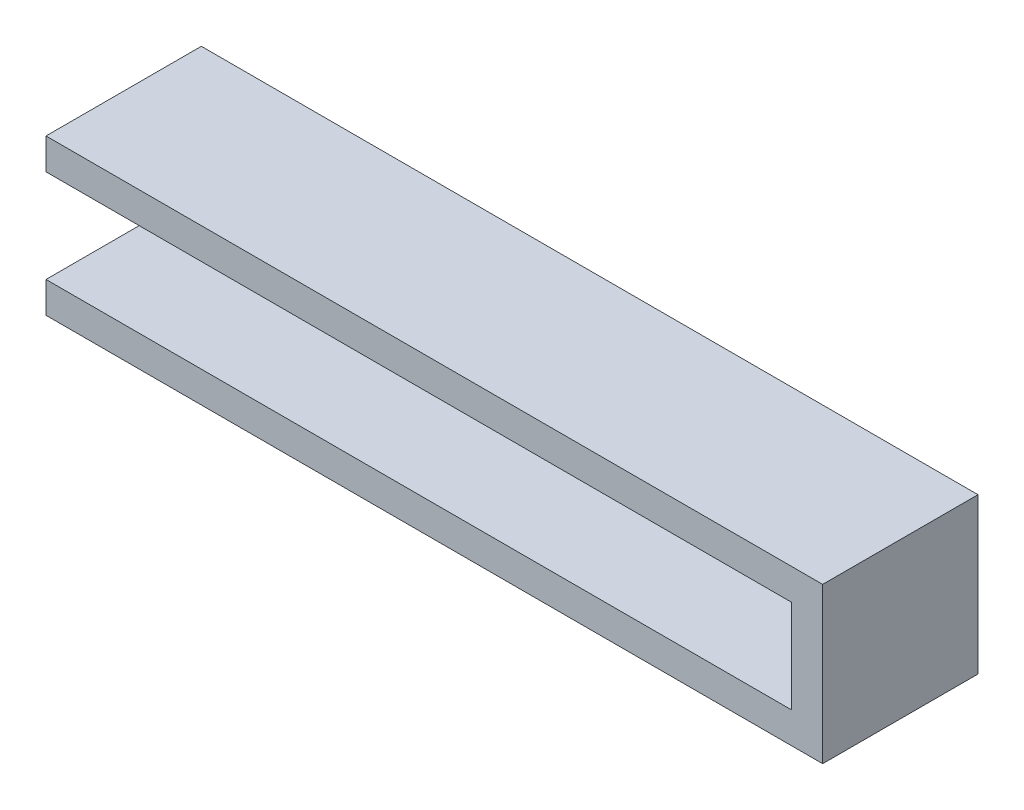
ISO-10303-21;
HEADER;
FILE_DESCRIPTION(('STEP AP214'),'2;1');
FILE_NAME('part.step','',(''),(''),'','','');
FILE_SCHEMA(('AUTOMOTIVE_DESIGN { 1 0 10303 214 1 1 1 1 }'));
ENDSEC;
DATA;
#1=APPLICATION_CONTEXT('core data for automotive mechanical design processes');
#2=APPLICATION_PROTOCOL_DEFINITION('international standard','automotive_design',2000,#1);
#3=PRODUCT_CONTEXT('',#1,'mechanical');
#4=PRODUCT('Part','Part','',(#3));
#5=PRODUCT_RELATED_PRODUCT_CATEGORY('part','',(#4));
#6=PRODUCT_DEFINITION_FORMATION('','',#4);
#7=PRODUCT_DEFINITION_CONTEXT('part definition',#1,'design');
#8=PRODUCT_DEFINITION('design','',#6,#7);
#9=PRODUCT_DEFINITION_SHAPE('','',#8);
#10=(LENGTH_UNIT() NAMED_UNIT(*) SI_UNIT(.MILLI.,.METRE.));
#11=(NAMED_UNIT(*) PLANE_ANGLE_UNIT() SI_UNIT($,.RADIAN.));
#12=(NAMED_UNIT(*) SI_UNIT($,.STERADIAN.) SOLID_ANGLE_UNIT());
#13=UNCERTAINTY_MEASURE_WITH_UNIT(LENGTH_MEASURE(1.E-05),#10,'distance_accuracy_value','');
#14=(GEOMETRIC_REPRESENTATION_CONTEXT(3) GLOBAL_UNCERTAINTY_ASSIGNED_CONTEXT((#13)) GLOBAL_UNIT_ASSIGNED_CONTEXT((#10,
#11,#12)) REPRESENTATION_CONTEXT('',''));
#15=CARTESIAN_POINT('',(0.,0.,0.));
#16=DIRECTION('',(0.,0.,1.));
#17=DIRECTION('',(1.,0.,0.));
#18=AXIS2_PLACEMENT_3D('',#15,#16,#17);
#19=CARTESIAN_POINT('',(12.5,-2.5,-5.));
#20=DIRECTION('',(-1.,0.,0.));
#21=DIRECTION('',(0.,0.,-1.));
#22=AXIS2_PLACEMENT_3D('',#19,#20,#21);
#23=PLANE('',#22);
#24=DIRECTION('',(0.,1.,0.));
#25=VECTOR('',#24,1.);
#26=CARTESIAN_POINT('',(12.5,-2.5,0.));
#27=LINE('',#26,#25);
#28=CARTESIAN_POINT('',(12.5,-2.5,0.));
#29=VERTEX_POINT('',#28);
#30=CARTESIAN_POINT('',(12.5,2.5,0.));
#31=VERTEX_POINT('',#30);
#32=EDGE_CURVE('E147',#29,#31,#27,.T.);
#33=ORIENTED_EDGE('',*,*,#32,.F.);
#34=DIRECTION('',(0.,0.,1.));
#35=VECTOR('',#34,1.);
#36=CARTESIAN_POINT('',(12.5,-2.5,-5.));
#37=LINE('',#36,#35);
#38=CARTESIAN_POINT('',(12.5,-2.5,-5.));
#39=VERTEX_POINT('',#38);
#40=EDGE_CURVE('E160',#39,#29,#37,.T.);
#41=ORIENTED_EDGE('',*,*,#40,.F.);
#42=DIRECTION('',(0.,1.,0.));
#43=VECTOR('',#42,1.);
#44=CARTESIAN_POINT('',(12.5,-2.5,-5.));
#45=LINE('',#44,#43);
#46=CARTESIAN_POINT('',(12.5,2.5,-5.));
#47=VERTEX_POINT('',#46);
#48=EDGE_CURVE('E148',#39,#47,#45,.T.);
#49=ORIENTED_EDGE('',*,*,#48,.T.);
#50=DIRECTION('',(0.,0.,1.));
#51=VECTOR('',#50,1.);
#52=CARTESIAN_POINT('',(12.5,2.5,-5.));
#53=LINE('',#52,#51);
#54=EDGE_CURVE('E11',#47,#31,#53,.T.);
#55=ORIENTED_EDGE('',*,*,#54,.T.);
#56=EDGE_LOOP('',(#33,#41,#49,#55));
#57=FACE_BOUND('',#56,.T.);
#58=ADVANCED_FACE('F37',(#57),#23,.F.);
#59=CARTESIAN_POINT('',(-12.5,2.5,-5.));
#60=DIRECTION('',(0.,-1.,0.));
#61=DIRECTION('',(0.,0.,1.));
#62=AXIS2_PLACEMENT_3D('',#59,#60,#61);
#63=PLANE('',#62);
#64=DIRECTION('',(-1.,0.,0.));
#65=VECTOR('',#64,1.);
#66=CARTESIAN_POINT('',(-12.5,2.5,0.));
#67=LINE('',#66,#65);
#68=CARTESIAN_POINT('',(-12.5,2.5,0.));
#69=VERTEX_POINT('',#68);
#70=EDGE_CURVE('E163',#31,#69,#67,.T.);
#71=ORIENTED_EDGE('',*,*,#70,.F.);
#72=ORIENTED_EDGE('',*,*,#54,.F.);
#73=DIRECTION('',(-1.,0.,0.));
#74=VECTOR('',#73,1.);
#75=CARTESIAN_POINT('',(-12.5,2.5,-5.));
#76=LINE('',#75,#74);
#77=CARTESIAN_POINT('',(-12.5,2.5,-5.));
#78=VERTEX_POINT('',#77);
#79=EDGE_CURVE('E151',#47,#78,#76,.T.);
#80=ORIENTED_EDGE('',*,*,#79,.T.);
#81=DIRECTION('',(0.,0.,1.));
#82=VECTOR('',#81,1.);
#83=CARTESIAN_POINT('',(-12.5,2.5,-5.));
#84=LINE('',#83,#82);
#85=EDGE_CURVE('E45',#78,#69,#84,.T.);
#86=ORIENTED_EDGE('',*,*,#85,.T.);
#87=EDGE_LOOP('',(#71,#72,#80,#86));
#88=FACE_BOUND('',#87,.T.);
#89=ADVANCED_FACE('F178',(#88),#63,.F.);
#90=CARTESIAN_POINT('',(-12.5,-2.5,-5.));
#91=DIRECTION('',(1.,0.,0.));
#92=DIRECTION('',(0.,0.,1.));
#93=AXIS2_PLACEMENT_3D('',#90,#91,#92);
#94=PLANE('',#93);
#95=DIRECTION('',(0.,1.,0.));
#96=VECTOR('',#95,1.);
#97=CARTESIAN_POINT('',(-12.5,-1.5,-3.));
#98=LINE('',#97,#96);
#99=CARTESIAN_POINT('',(-12.5,-1.5,-3.));
#100=VERTEX_POINT('',#99);
#101=CARTESIAN_POINT('',(-12.5,1.5,-3.));
#102=VERTEX_POINT('',#101);
#103=EDGE_CURVE('E109',#100,#102,#98,.T.);
#104=ORIENTED_EDGE('',*,*,#103,.T.);
#105=DIRECTION('',(0.,0.,1.));
#106=VECTOR('',#105,1.);
#107=CARTESIAN_POINT('',(-12.5,1.5,-3.));
#108=LINE('',#107,#106);
#109=CARTESIAN_POINT('',(-12.5,1.5,0.));
#110=VERTEX_POINT('',#109);
#111=EDGE_CURVE('E114',#102,#110,#108,.T.);
#112=ORIENTED_EDGE('',*,*,#111,.T.);
#113=DIRECTION('',(0.,-1.,0.));
#114=VECTOR('',#113,1.);
#115=CARTESIAN_POINT('',(-12.5,-2.5,0.));
#116=LINE('',#115,#114);
#117=EDGE_CURVE('E167',#69,#110,#116,.T.);
#118=ORIENTED_EDGE('',*,*,#117,.F.);
#119=ORIENTED_EDGE('',*,*,#85,.F.);
#120=DIRECTION('',(0.,-1.,0.));
#121=VECTOR('',#120,1.);
#122=CARTESIAN_POINT('',(-12.5,-2.5,-5.));
#123=LINE('',#122,#121);
#124=CARTESIAN_POINT('',(-12.5,-2.5,-5.));
#125=VERTEX_POINT('',#124);
#126=EDGE_CURVE('E155',#78,#125,#123,.T.);
#127=ORIENTED_EDGE('',*,*,#126,.T.);
#128=DIRECTION('',(0.,0.,1.));
#129=VECTOR('',#128,1.);
#130=CARTESIAN_POINT('',(-12.5,-2.5,-5.));
#131=LINE('',#130,#129);
#132=CARTESIAN_POINT('',(-12.5,-2.5,0.));
#133=VERTEX_POINT('',#132);
#134=EDGE_CURVE('E172',#125,#133,#131,.T.);
#135=ORIENTED_EDGE('',*,*,#134,.T.);
#136=CARTESIAN_POINT('',(-12.5,-1.5,0.));
#137=VERTEX_POINT('',#136);
#138=EDGE_CURVE('E166',#137,#133,#116,.T.);
#139=ORIENTED_EDGE('',*,*,#138,.F.);
#140=DIRECTION('',(0.,0.,1.));
#141=VECTOR('',#140,1.);
#142=CARTESIAN_POINT('',(-12.5,-1.5,-3.));
#143=LINE('',#142,#141);
#144=EDGE_CURVE('E124',#100,#137,#143,.T.);
#145=ORIENTED_EDGE('',*,*,#144,.F.);
#146=EDGE_LOOP('',(#104,#112,#118,#119,#127,#135,#139,#145));
#147=FACE_BOUND('',#146,.T.);
#148=ADVANCED_FACE('F121',(#147),#94,.F.);
#149=CARTESIAN_POINT('',(-12.5,-2.5,-5.));
#150=DIRECTION('',(0.,1.,0.));
#151=DIRECTION('',(0.,0.,-1.));
#152=AXIS2_PLACEMENT_3D('',#149,#150,#151);
#153=PLANE('',#152);
#154=DIRECTION('',(1.,0.,0.));
#155=VECTOR('',#154,1.);
#156=CARTESIAN_POINT('',(-12.5,-2.5,0.));
#157=LINE('',#156,#155);
#158=EDGE_CURVE('E152',#133,#29,#157,.T.);
#159=ORIENTED_EDGE('',*,*,#158,.F.);
#160=ORIENTED_EDGE('',*,*,#134,.F.);
#161=DIRECTION('',(1.,0.,0.));
#162=VECTOR('',#161,1.);
#163=CARTESIAN_POINT('',(-12.5,-2.5,-5.));
#164=LINE('',#163,#162);
#165=EDGE_CURVE('E158',#125,#39,#164,.T.);
#166=ORIENTED_EDGE('',*,*,#165,.T.);
#167=ORIENTED_EDGE('',*,*,#40,.T.);
#168=EDGE_LOOP('',(#159,#160,#166,#167));
#169=FACE_BOUND('',#168,.T.);
#170=ADVANCED_FACE('F191',(#169),#153,.F.);
#171=CARTESIAN_POINT('',(0.,0.,-5.));
#172=DIRECTION('',(0.,0.,1.));
#173=DIRECTION('',(-1.,0.,0.));
#174=AXIS2_PLACEMENT_3D('',#171,#172,#173);
#175=PLANE('',#174);
#176=CARTESIAN_POINT('',(-10.4078,0.,-5.));
#177=DIRECTION('',(0.,0.,1.));
#178=DIRECTION('',(1.,0.,0.));
#179=AXIS2_PLACEMENT_3D('',#176,#177,#178);
#180=CIRCLE('',#179,1.0922);
#181=CARTESIAN_POINT('',(-9.3156,0.,-5.));
#182=VERTEX_POINT('',#181);
#183=EDGE_CURVE('E141',#182,#182,#180,.T.);
#184=ORIENTED_EDGE('',*,*,#183,.T.);
#185=EDGE_LOOP('',(#184));
#186=FACE_BOUND('',#185,.T.);
#187=CARTESIAN_POINT('',(10.4078,0.,-5.));
#188=DIRECTION('',(0.,0.,1.));
#189=DIRECTION('',(1.,0.,0.));
#190=AXIS2_PLACEMENT_3D('',#187,#188,#189);
#191=CIRCLE('',#190,1.0922);
#192=CARTESIAN_POINT('',(11.5,0.,-5.));
#193=VERTEX_POINT('',#192);
#194=EDGE_CURVE('E144',#193,#193,#191,.T.);
#195=ORIENTED_EDGE('',*,*,#194,.T.);
#196=EDGE_LOOP('',(#195));
#197=FACE_BOUND('',#196,.T.);
#198=ORIENTED_EDGE('',*,*,#48,.F.);
#199=ORIENTED_EDGE('',*,*,#165,.F.);
#200=ORIENTED_EDGE('',*,*,#126,.F.);
#201=ORIENTED_EDGE('',*,*,#79,.F.);
#202=EDGE_LOOP('',(#198,#199,#200,#201));
#203=FACE_BOUND('',#202,.T.);
#204=ADVANCED_FACE('F188',(#186,#197,#203),#175,.F.);
#205=CARTESIAN_POINT('',(0.,0.,0.));
#206=DIRECTION('',(0.,0.,1.));
#207=DIRECTION('',(-1.,0.,0.));
#208=AXIS2_PLACEMENT_3D('',#205,#206,#207);
#209=PLANE('',#208);
#210=DIRECTION('',(-1.,0.,0.));
#211=VECTOR('',#210,1.);
#212=CARTESIAN_POINT('',(11.5,-1.5,0.));
#213=LINE('',#212,#211);
#214=CARTESIAN_POINT('',(11.5,-1.5,0.));
#215=VERTEX_POINT('',#214);
#216=EDGE_CURVE('E125',#215,#137,#213,.T.);
#217=ORIENTED_EDGE('',*,*,#216,.T.);
#218=ORIENTED_EDGE('',*,*,#138,.T.);
#219=ORIENTED_EDGE('',*,*,#158,.T.);
#220=ORIENTED_EDGE('',*,*,#32,.T.);
#221=ORIENTED_EDGE('',*,*,#70,.T.);
#222=ORIENTED_EDGE('',*,*,#117,.T.);
#223=DIRECTION('',(1.,0.,0.));
#224=VECTOR('',#223,1.);
#225=CARTESIAN_POINT('',(11.5,1.5,0.));
#226=LINE('',#225,#224);
#227=CARTESIAN_POINT('',(11.5,1.5,0.));
#228=VERTEX_POINT('',#227);
#229=EDGE_CURVE('E52',#110,#228,#226,.T.);
#230=ORIENTED_EDGE('',*,*,#229,.T.);
#231=DIRECTION('',(0.,-1.,0.));
#232=VECTOR('',#231,1.);
#233=CARTESIAN_POINT('',(11.5,-1.5,0.));
#234=LINE('',#233,#232);
#235=EDGE_CURVE('E127',#228,#215,#234,.T.);
#236=ORIENTED_EDGE('',*,*,#235,.T.);
#237=EDGE_LOOP('',(#217,#218,#219,#220,#221,#222,#230,#236));
#238=FACE_BOUND('',#237,.T.);
#239=ADVANCED_FACE('F181',(#238),#209,.T.);
#240=CARTESIAN_POINT('',(10.4078,0.,-5.));
#241=DIRECTION('',(0.,0.,-1.));
#242=DIRECTION('',(1.,0.,0.));
#243=AXIS2_PLACEMENT_3D('',#240,#241,#242);
#244=CYLINDRICAL_SURFACE('',#243,1.0922);
#245=CARTESIAN_POINT('',(10.4078,0.,-3.));
#246=DIRECTION('',(0.,0.,1.));
#247=DIRECTION('',(1.,0.,0.));
#248=AXIS2_PLACEMENT_3D('',#245,#246,#247);
#249=CIRCLE('',#248,1.0922);
#250=CARTESIAN_POINT('',(11.5,0.,-3.));
#251=VERTEX_POINT('',#250);
#252=EDGE_CURVE('E139',#251,#251,#249,.F.);
#253=ORIENTED_EDGE('',*,*,#252,.F.);
#254=EDGE_LOOP('',(#253));
#255=FACE_BOUND('',#254,.T.);
#256=ORIENTED_EDGE('',*,*,#194,.F.);
#257=EDGE_LOOP('',(#256));
#258=FACE_BOUND('',#257,.T.);
#259=ADVANCED_FACE('F201',(#255,#258),#244,.F.);
#260=CARTESIAN_POINT('',(-10.4078,0.,-5.));
#261=DIRECTION('',(0.,0.,-1.));
#262=DIRECTION('',(1.,0.,0.));
#263=AXIS2_PLACEMENT_3D('',#260,#261,#262);
#264=CYLINDRICAL_SURFACE('',#263,1.0922);
#265=CARTESIAN_POINT('',(-10.4078,0.,-3.));
#266=DIRECTION('',(0.,0.,1.));
#267=DIRECTION('',(1.,0.,0.));
#268=AXIS2_PLACEMENT_3D('',#265,#266,#267);
#269=CIRCLE('',#268,1.0922);
#270=CARTESIAN_POINT('',(-9.3156,0.,-3.));
#271=VERTEX_POINT('',#270);
#272=EDGE_CURVE('E40',#271,#271,#269,.F.);
#273=ORIENTED_EDGE('',*,*,#272,.F.);
#274=EDGE_LOOP('',(#273));
#275=FACE_BOUND('',#274,.T.);
#276=ORIENTED_EDGE('',*,*,#183,.F.);
#277=EDGE_LOOP('',(#276));
#278=FACE_BOUND('',#277,.T.);
#279=ADVANCED_FACE('F204',(#275,#278),#264,.F.);
#280=CARTESIAN_POINT('',(11.5,-1.5,-3.));
#281=DIRECTION('',(1.,0.,0.));
#282=DIRECTION('',(0.,0.,1.));
#283=AXIS2_PLACEMENT_3D('',#280,#281,#282);
#284=PLANE('',#283);
#285=DIRECTION('',(0.,-1.,0.));
#286=VECTOR('',#285,1.);
#287=CARTESIAN_POINT('',(11.5,-1.5,-3.));
#288=LINE('',#287,#286);
#289=CARTESIAN_POINT('',(11.5,1.5,-3.));
#290=VERTEX_POINT('',#289);
#291=EDGE_CURVE('E110',#290,#251,#288,.T.);
#292=ORIENTED_EDGE('',*,*,#291,.T.);
#293=CARTESIAN_POINT('',(11.5,-1.5,-3.));
#294=VERTEX_POINT('',#293);
#295=EDGE_CURVE('E60',#251,#294,#288,.T.);
#296=ORIENTED_EDGE('',*,*,#295,.T.);
#297=DIRECTION('',(0.,0.,1.));
#298=VECTOR('',#297,1.);
#299=CARTESIAN_POINT('',(11.5,-1.5,-3.));
#300=LINE('',#299,#298);
#301=EDGE_CURVE('E136',#294,#215,#300,.T.);
#302=ORIENTED_EDGE('',*,*,#301,.T.);
#303=ORIENTED_EDGE('',*,*,#235,.F.);
#304=DIRECTION('',(0.,0.,1.));
#305=VECTOR('',#304,1.);
#306=CARTESIAN_POINT('',(11.5,1.5,-3.));
#307=LINE('',#306,#305);
#308=EDGE_CURVE('E117',#290,#228,#307,.T.);
#309=ORIENTED_EDGE('',*,*,#308,.F.);
#310=EDGE_LOOP('',(#292,#296,#302,#303,#309));
#311=FACE_BOUND('',#310,.T.);
#312=ADVANCED_FACE('F198',(#311),#284,.F.);
#313=CARTESIAN_POINT('',(0.,0.,-3.));
#314=DIRECTION('',(0.,0.,-1.));
#315=DIRECTION('',(1.,0.,0.));
#316=AXIS2_PLACEMENT_3D('',#313,#314,#315);
#317=PLANE('',#316);
#318=ORIENTED_EDGE('',*,*,#272,.T.);
#319=EDGE_LOOP('',(#318));
#320=FACE_BOUND('',#319,.T.);
#321=ORIENTED_EDGE('',*,*,#295,.F.);
#322=ORIENTED_EDGE('',*,*,#252,.T.);
#323=ORIENTED_EDGE('',*,*,#291,.F.);
#324=DIRECTION('',(1.,0.,0.));
#325=VECTOR('',#324,1.);
#326=CARTESIAN_POINT('',(11.5,1.5,-3.));
#327=LINE('',#326,#325);
#328=EDGE_CURVE('E106',#102,#290,#327,.T.);
#329=ORIENTED_EDGE('',*,*,#328,.F.);
#330=ORIENTED_EDGE('',*,*,#103,.F.);
#331=DIRECTION('',(-1.,0.,0.));
#332=VECTOR('',#331,1.);
#333=CARTESIAN_POINT('',(11.5,-1.5,-3.));
#334=LINE('',#333,#332);
#335=EDGE_CURVE('E118',#294,#100,#334,.T.);
#336=ORIENTED_EDGE('',*,*,#335,.F.);
#337=EDGE_LOOP('',(#321,#322,#323,#329,#330,#336));
#338=FACE_BOUND('',#337,.T.);
#339=ADVANCED_FACE('F107',(#320,#338),#317,.F.);
#340=CARTESIAN_POINT('',(11.5,-1.5,-3.));
#341=DIRECTION('',(0.,-1.,0.));
#342=DIRECTION('',(0.,0.,1.));
#343=AXIS2_PLACEMENT_3D('',#340,#341,#342);
#344=PLANE('',#343);
#345=ORIENTED_EDGE('',*,*,#216,.F.);
#346=ORIENTED_EDGE('',*,*,#301,.F.);
#347=ORIENTED_EDGE('',*,*,#335,.T.);
#348=ORIENTED_EDGE('',*,*,#144,.T.);
#349=EDGE_LOOP('',(#345,#346,#347,#348));
#350=FACE_BOUND('',#349,.T.);
#351=ADVANCED_FACE('F196',(#350),#344,.F.);
#352=CARTESIAN_POINT('',(11.5,1.5,-3.));
#353=DIRECTION('',(0.,1.,0.));
#354=DIRECTION('',(0.,0.,-1.));
#355=AXIS2_PLACEMENT_3D('',#352,#353,#354);
#356=PLANE('',#355);
#357=ORIENTED_EDGE('',*,*,#229,.F.);
#358=ORIENTED_EDGE('',*,*,#111,.F.);
#359=ORIENTED_EDGE('',*,*,#328,.T.);
#360=ORIENTED_EDGE('',*,*,#308,.T.);
#361=EDGE_LOOP('',(#357,#358,#359,#360));
#362=FACE_BOUND('',#361,.T.);
#363=ADVANCED_FACE('F115',(#362),#356,.F.);
#364=CLOSED_SHELL('',(#58,#89,#148,#170,#204,#239,#259,#279,#312,#339,#351,#363));
#365=MANIFOLD_SOLID_BREP('B2',#364);
#366=ADVANCED_BREP_SHAPE_REPRESENTATION('',(#18,#365),#14);
#367=SHAPE_DEFINITION_REPRESENTATION(#9,#366);
ENDSEC;
END-ISO-10303-21;
